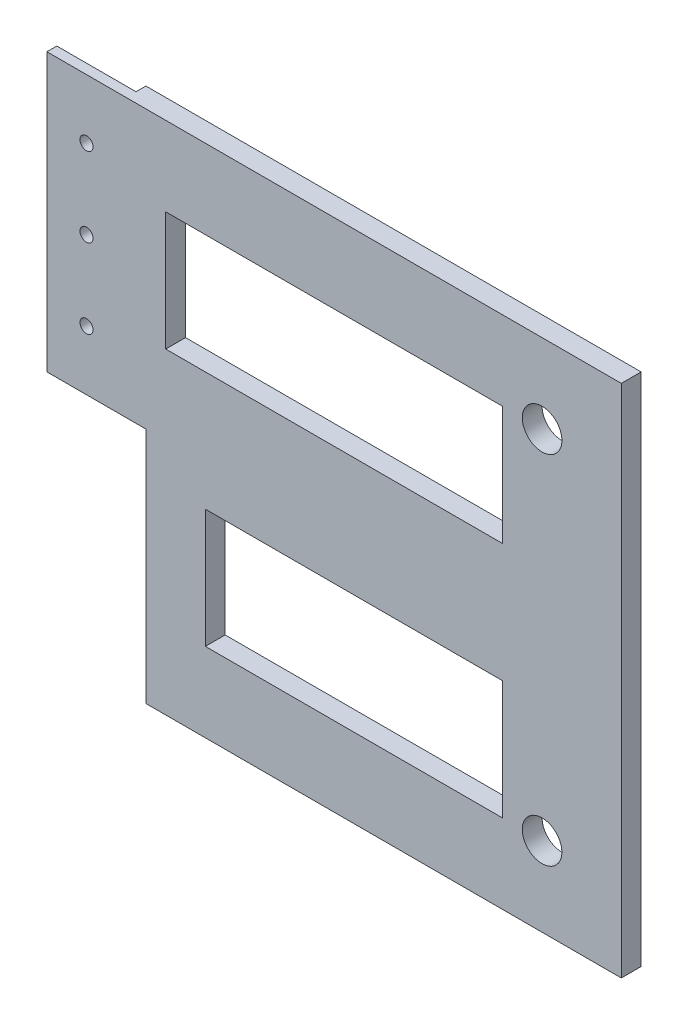
ISO-10303-21;
HEADER;
FILE_DESCRIPTION(('STEP AP214'),'2;1');
FILE_NAME('part.step','',(''),(''),'','','');
FILE_SCHEMA(('AUTOMOTIVE_DESIGN { 1 0 10303 214 1 1 1 1 }'));
ENDSEC;
DATA;
#1=APPLICATION_CONTEXT('core data for automotive mechanical design processes');
#2=APPLICATION_PROTOCOL_DEFINITION('international standard','automotive_design',2000,#1);
#3=PRODUCT_CONTEXT('',#1,'mechanical');
#4=PRODUCT('Part','Part','',(#3));
#5=PRODUCT_RELATED_PRODUCT_CATEGORY('part','',(#4));
#6=PRODUCT_DEFINITION_FORMATION('','',#4);
#7=PRODUCT_DEFINITION_CONTEXT('part definition',#1,'design');
#8=PRODUCT_DEFINITION('design','',#6,#7);
#9=PRODUCT_DEFINITION_SHAPE('','',#8);
#10=(LENGTH_UNIT() NAMED_UNIT(*) SI_UNIT(.MILLI.,.METRE.));
#11=(NAMED_UNIT(*) PLANE_ANGLE_UNIT() SI_UNIT($,.RADIAN.));
#12=(NAMED_UNIT(*) SI_UNIT($,.STERADIAN.) SOLID_ANGLE_UNIT());
#13=UNCERTAINTY_MEASURE_WITH_UNIT(LENGTH_MEASURE(1.E-05),#10,'distance_accuracy_value','');
#14=(GEOMETRIC_REPRESENTATION_CONTEXT(3) GLOBAL_UNCERTAINTY_ASSIGNED_CONTEXT((#13)) GLOBAL_UNIT_ASSIGNED_CONTEXT((#10,
#11,#12)) REPRESENTATION_CONTEXT('',''));
#15=CARTESIAN_POINT('',(0.,0.,0.));
#16=DIRECTION('',(0.,0.,1.));
#17=DIRECTION('',(1.,0.,0.));
#18=AXIS2_PLACEMENT_3D('',#15,#16,#17);
#19=CARTESIAN_POINT('',(0.,0.,6.35));
#20=DIRECTION('',(0.,0.,1.));
#21=DIRECTION('',(1.,0.,0.));
#22=AXIS2_PLACEMENT_3D('',#19,#20,#21);
#23=PLANE('',#22);
#24=CARTESIAN_POINT('',(12.6999999999999,38.1,6.35));
#25=DIRECTION('',(0.,0.,1.));
#26=DIRECTION('',(1.,0.,0.));
#27=AXIS2_PLACEMENT_3D('',#24,#25,#26);
#28=CIRCLE('',#27,2.09999999999999);
#29=CARTESIAN_POINT('',(14.7999999999999,38.1,6.35));
#30=VERTEX_POINT('',#29);
#31=EDGE_CURVE('E545',#30,#30,#28,.T.);
#32=ORIENTED_EDGE('',*,*,#31,.F.);
#33=EDGE_LOOP('',(#32));
#34=FACE_BOUND('',#33,.T.);
#35=CARTESIAN_POINT('',(12.6999999999999,63.5,6.35));
#36=DIRECTION('',(0.,0.,1.));
#37=DIRECTION('',(1.,0.,0.));
#38=AXIS2_PLACEMENT_3D('',#35,#36,#37);
#39=CIRCLE('',#38,2.09999999999999);
#40=CARTESIAN_POINT('',(14.7999999999999,63.5,6.35));
#41=VERTEX_POINT('',#40);
#42=EDGE_CURVE('E41',#41,#41,#39,.T.);
#43=ORIENTED_EDGE('',*,*,#42,.F.);
#44=EDGE_LOOP('',(#43));
#45=FACE_BOUND('',#44,.T.);
#46=CARTESIAN_POINT('',(12.6999999999999,12.7,6.35));
#47=DIRECTION('',(0.,0.,1.));
#48=DIRECTION('',(1.,0.,0.));
#49=AXIS2_PLACEMENT_3D('',#46,#47,#48);
#50=CIRCLE('',#49,2.09999999999999);
#51=CARTESIAN_POINT('',(14.7999999999999,12.7,6.35));
#52=VERTEX_POINT('',#51);
#53=EDGE_CURVE('E202',#52,#52,#50,.T.);
#54=ORIENTED_EDGE('',*,*,#53,.F.);
#55=EDGE_LOOP('',(#54));
#56=FACE_BOUND('',#55,.T.);
#57=CARTESIAN_POINT('',(158.75,57.15,6.35));
#58=DIRECTION('',(0.,0.,1.));
#59=DIRECTION('',(1.,0.,0.));
#60=AXIS2_PLACEMENT_3D('',#57,#58,#59);
#61=CIRCLE('',#60,6.35);
#62=CARTESIAN_POINT('',(165.1,57.15,6.35));
#63=VERTEX_POINT('',#62);
#64=EDGE_CURVE('E269',#63,#63,#61,.T.);
#65=ORIENTED_EDGE('',*,*,#64,.F.);
#66=EDGE_LOOP('',(#65));
#67=FACE_BOUND('',#66,.T.);
#68=CARTESIAN_POINT('',(158.75,-57.15,6.35));
#69=DIRECTION('',(0.,0.,1.));
#70=DIRECTION('',(1.,0.,0.));
#71=AXIS2_PLACEMENT_3D('',#68,#69,#70);
#72=CIRCLE('',#71,6.35);
#73=CARTESIAN_POINT('',(165.1,-57.15,6.35));
#74=VERTEX_POINT('',#73);
#75=EDGE_CURVE('E263',#74,#74,#72,.T.);
#76=ORIENTED_EDGE('',*,*,#75,.F.);
#77=EDGE_LOOP('',(#76));
#78=FACE_BOUND('',#77,.T.);
#79=DIRECTION('',(1.,0.,0.));
#80=VECTOR('',#79,1.);
#81=CARTESIAN_POINT('',(31.7499999999999,-82.55,6.35));
#82=LINE('',#81,#80);
#83=CARTESIAN_POINT('',(31.7499999999999,-82.55,6.35));
#84=VERTEX_POINT('',#83);
#85=CARTESIAN_POINT('',(184.15,-82.55,6.35));
#86=VERTEX_POINT('',#85);
#87=EDGE_CURVE('E275',#84,#86,#82,.T.);
#88=ORIENTED_EDGE('',*,*,#87,.T.);
#89=DIRECTION('',(0.,1.,0.));
#90=VECTOR('',#89,1.);
#91=CARTESIAN_POINT('',(184.15,-82.55,6.35));
#92=LINE('',#91,#90);
#93=CARTESIAN_POINT('',(184.15,82.55,6.35));
#94=VERTEX_POINT('',#93);
#95=EDGE_CURVE('E278',#86,#94,#92,.T.);
#96=ORIENTED_EDGE('',*,*,#95,.T.);
#97=DIRECTION('',(1.,0.,0.));
#98=VECTOR('',#97,1.);
#99=CARTESIAN_POINT('',(0.,82.55,6.35));
#100=LINE('',#99,#98);
#101=CARTESIAN_POINT('',(0.,82.55,6.35));
#102=VERTEX_POINT('',#101);
#103=EDGE_CURVE('E281',#102,#94,#100,.T.);
#104=ORIENTED_EDGE('',*,*,#103,.F.);
#105=DIRECTION('',(0.,1.,0.));
#106=VECTOR('',#105,1.);
#107=CARTESIAN_POINT('',(0.,-6.34999999999999,6.35));
#108=LINE('',#107,#106);
#109=CARTESIAN_POINT('',(0.,-6.34999999999999,6.35));
#110=VERTEX_POINT('',#109);
#111=EDGE_CURVE('E173',#110,#102,#108,.T.);
#112=ORIENTED_EDGE('',*,*,#111,.F.);
#113=DIRECTION('',(1.,0.,0.));
#114=VECTOR('',#113,1.);
#115=CARTESIAN_POINT('',(0.,-6.34999999999999,6.35));
#116=LINE('',#115,#114);
#117=CARTESIAN_POINT('',(31.7499999999999,-6.34999999999999,6.35));
#118=VERTEX_POINT('',#117);
#119=EDGE_CURVE('E284',#110,#118,#116,.T.);
#120=ORIENTED_EDGE('',*,*,#119,.T.);
#121=DIRECTION('',(0.,-1.,0.));
#122=VECTOR('',#121,1.);
#123=CARTESIAN_POINT('',(31.7499999999999,-6.34999999999999,6.35));
#124=LINE('',#123,#122);
#125=EDGE_CURVE('E286',#118,#84,#124,.T.);
#126=ORIENTED_EDGE('',*,*,#125,.T.);
#127=EDGE_LOOP('',(#88,#96,#104,#112,#120,#126));
#128=FACE_BOUND('',#127,.T.);
#129=DIRECTION('',(-1.,0.,0.));
#130=VECTOR('',#129,1.);
#131=CARTESIAN_POINT('',(146.05,-19.05,6.35));
#132=LINE('',#131,#130);
#133=CARTESIAN_POINT('',(146.05,-19.05,6.35));
#134=VERTEX_POINT('',#133);
#135=CARTESIAN_POINT('',(50.7999999999999,-19.05,6.35));
#136=VERTEX_POINT('',#135);
#137=EDGE_CURVE('E252',#134,#136,#132,.T.);
#138=ORIENTED_EDGE('',*,*,#137,.F.);
#139=DIRECTION('',(0.,-1.,0.));
#140=VECTOR('',#139,1.);
#141=CARTESIAN_POINT('',(146.05,-19.05,6.35));
#142=LINE('',#141,#140);
#143=CARTESIAN_POINT('',(146.05,-57.15,6.35));
#144=VERTEX_POINT('',#143);
#145=EDGE_CURVE('E226',#134,#144,#142,.T.);
#146=ORIENTED_EDGE('',*,*,#145,.T.);
#147=DIRECTION('',(-1.,0.,0.));
#148=VECTOR('',#147,1.);
#149=CARTESIAN_POINT('',(146.05,-57.15,6.35));
#150=LINE('',#149,#148);
#151=CARTESIAN_POINT('',(50.7999999999999,-57.15,6.35));
#152=VERTEX_POINT('',#151);
#153=EDGE_CURVE('E258',#144,#152,#150,.T.);
#154=ORIENTED_EDGE('',*,*,#153,.T.);
#155=DIRECTION('',(0.,-1.,0.));
#156=VECTOR('',#155,1.);
#157=CARTESIAN_POINT('',(50.7999999999999,-19.05,6.35));
#158=LINE('',#157,#156);
#159=EDGE_CURVE('E255',#136,#152,#158,.T.);
#160=ORIENTED_EDGE('',*,*,#159,.F.);
#161=EDGE_LOOP('',(#138,#146,#154,#160));
#162=FACE_BOUND('',#161,.T.);
#163=DIRECTION('',(-1.,0.,0.));
#164=VECTOR('',#163,1.);
#165=CARTESIAN_POINT('',(0.,57.15,6.35));
#166=LINE('',#165,#164);
#167=CARTESIAN_POINT('',(146.05,57.15,6.35));
#168=VERTEX_POINT('',#167);
#169=CARTESIAN_POINT('',(38.1,57.15,6.35));
#170=VERTEX_POINT('',#169);
#171=EDGE_CURVE('E225',#168,#170,#166,.T.);
#172=ORIENTED_EDGE('',*,*,#171,.F.);
#173=DIRECTION('',(0.,-1.,0.));
#174=VECTOR('',#173,1.);
#175=CARTESIAN_POINT('',(146.05,0.,6.35));
#176=LINE('',#175,#174);
#177=CARTESIAN_POINT('',(146.05,19.05,6.35));
#178=VERTEX_POINT('',#177);
#179=EDGE_CURVE('E62',#168,#178,#176,.T.);
#180=ORIENTED_EDGE('',*,*,#179,.T.);
#181=DIRECTION('',(-1.,0.,0.));
#182=VECTOR('',#181,1.);
#183=CARTESIAN_POINT('',(0.,19.05,6.35));
#184=LINE('',#183,#182);
#185=CARTESIAN_POINT('',(38.1,19.05,6.35));
#186=VERTEX_POINT('',#185);
#187=EDGE_CURVE('E232',#178,#186,#184,.T.);
#188=ORIENTED_EDGE('',*,*,#187,.T.);
#189=DIRECTION('',(0.,-1.,0.));
#190=VECTOR('',#189,1.);
#191=CARTESIAN_POINT('',(38.1,0.,6.35));
#192=LINE('',#191,#190);
#193=EDGE_CURVE('E229',#170,#186,#192,.T.);
#194=ORIENTED_EDGE('',*,*,#193,.F.);
#195=EDGE_LOOP('',(#172,#180,#188,#194));
#196=FACE_BOUND('',#195,.T.);
#197=ADVANCED_FACE('F37',(#34,#45,#56,#67,#78,#128,#162,#196),#23,.T.);
#198=CARTESIAN_POINT('',(0.,0.,0.));
#199=DIRECTION('',(0.,0.,1.));
#200=DIRECTION('',(1.,0.,0.));
#201=AXIS2_PLACEMENT_3D('',#198,#199,#200);
#202=PLANE('',#201);
#203=DIRECTION('',(0.,-1.,0.));
#204=VECTOR('',#203,1.);
#205=CARTESIAN_POINT('',(146.05,0.,0.));
#206=LINE('',#205,#204);
#207=CARTESIAN_POINT('',(146.05,-19.05,0.));
#208=VERTEX_POINT('',#207);
#209=CARTESIAN_POINT('',(146.05,-57.15,0.));
#210=VERTEX_POINT('',#209);
#211=EDGE_CURVE('E194',#208,#210,#206,.T.);
#212=ORIENTED_EDGE('',*,*,#211,.F.);
#213=DIRECTION('',(-1.,0.,0.));
#214=VECTOR('',#213,1.);
#215=CARTESIAN_POINT('',(0.,-19.05,0.));
#216=LINE('',#215,#214);
#217=CARTESIAN_POINT('',(50.7999999999999,-19.05,0.));
#218=VERTEX_POINT('',#217);
#219=EDGE_CURVE('E186',#208,#218,#216,.T.);
#220=ORIENTED_EDGE('',*,*,#219,.T.);
#221=DIRECTION('',(0.,-1.,0.));
#222=VECTOR('',#221,1.);
#223=CARTESIAN_POINT('',(50.7999999999999,0.,0.));
#224=LINE('',#223,#222);
#225=CARTESIAN_POINT('',(50.7999999999999,-57.15,0.));
#226=VERTEX_POINT('',#225);
#227=EDGE_CURVE('E189',#218,#226,#224,.T.);
#228=ORIENTED_EDGE('',*,*,#227,.T.);
#229=DIRECTION('',(-1.,0.,0.));
#230=VECTOR('',#229,1.);
#231=CARTESIAN_POINT('',(0.,-57.15,0.));
#232=LINE('',#231,#230);
#233=EDGE_CURVE('E192',#210,#226,#232,.T.);
#234=ORIENTED_EDGE('',*,*,#233,.F.);
#235=EDGE_LOOP('',(#212,#220,#228,#234));
#236=FACE_BOUND('',#235,.T.);
#237=CARTESIAN_POINT('',(158.75,57.15,0.));
#238=DIRECTION('',(0.,0.,1.));
#239=DIRECTION('',(1.,0.,0.));
#240=AXIS2_PLACEMENT_3D('',#237,#238,#239);
#241=CIRCLE('',#240,6.35);
#242=CARTESIAN_POINT('',(165.1,57.15,0.));
#243=VERTEX_POINT('',#242);
#244=EDGE_CURVE('E266',#243,#243,#241,.T.);
#245=ORIENTED_EDGE('',*,*,#244,.T.);
#246=EDGE_LOOP('',(#245));
#247=FACE_BOUND('',#246,.T.);
#248=CARTESIAN_POINT('',(158.75,-57.15,0.));
#249=DIRECTION('',(0.,0.,1.));
#250=DIRECTION('',(1.,0.,0.));
#251=AXIS2_PLACEMENT_3D('',#248,#249,#250);
#252=CIRCLE('',#251,6.35);
#253=CARTESIAN_POINT('',(165.1,-57.15,0.));
#254=VERTEX_POINT('',#253);
#255=EDGE_CURVE('E238',#254,#254,#252,.T.);
#256=ORIENTED_EDGE('',*,*,#255,.T.);
#257=EDGE_LOOP('',(#256));
#258=FACE_BOUND('',#257,.T.);
#259=DIRECTION('',(1.,0.,0.));
#260=VECTOR('',#259,1.);
#261=CARTESIAN_POINT('',(0.,-6.34999999999999,0.));
#262=LINE('',#261,#260);
#263=CARTESIAN_POINT('',(25.3999999999999,-6.34999999999999,0.));
#264=VERTEX_POINT('',#263);
#265=CARTESIAN_POINT('',(31.7499999999999,-6.34999999999999,0.));
#266=VERTEX_POINT('',#265);
#267=EDGE_CURVE('E296',#264,#266,#262,.T.);
#268=ORIENTED_EDGE('',*,*,#267,.F.);
#269=DIRECTION('',(0.,-1.,0.));
#270=VECTOR('',#269,1.);
#271=CARTESIAN_POINT('',(25.3999999999999,82.55,0.));
#272=LINE('',#271,#270);
#273=CARTESIAN_POINT('',(25.3999999999999,82.55,0.));
#274=VERTEX_POINT('',#273);
#275=EDGE_CURVE('E160',#274,#264,#272,.T.);
#276=ORIENTED_EDGE('',*,*,#275,.F.);
#277=DIRECTION('',(1.,0.,0.));
#278=VECTOR('',#277,1.);
#279=CARTESIAN_POINT('',(0.,82.55,0.));
#280=LINE('',#279,#278);
#281=CARTESIAN_POINT('',(184.15,82.55,0.));
#282=VERTEX_POINT('',#281);
#283=EDGE_CURVE('E294',#274,#282,#280,.T.);
#284=ORIENTED_EDGE('',*,*,#283,.T.);
#285=DIRECTION('',(0.,1.,0.));
#286=VECTOR('',#285,1.);
#287=CARTESIAN_POINT('',(184.15,-82.55,0.));
#288=LINE('',#287,#286);
#289=CARTESIAN_POINT('',(184.15,-82.55,0.));
#290=VERTEX_POINT('',#289);
#291=EDGE_CURVE('E291',#290,#282,#288,.T.);
#292=ORIENTED_EDGE('',*,*,#291,.F.);
#293=DIRECTION('',(1.,0.,0.));
#294=VECTOR('',#293,1.);
#295=CARTESIAN_POINT('',(31.7499999999999,-82.55,0.));
#296=LINE('',#295,#294);
#297=CARTESIAN_POINT('',(31.7499999999999,-82.55,0.));
#298=VERTEX_POINT('',#297);
#299=EDGE_CURVE('E272',#298,#290,#296,.T.);
#300=ORIENTED_EDGE('',*,*,#299,.F.);
#301=DIRECTION('',(0.,-1.,0.));
#302=VECTOR('',#301,1.);
#303=CARTESIAN_POINT('',(31.7499999999999,-6.34999999999999,0.));
#304=LINE('',#303,#302);
#305=EDGE_CURVE('E279',#266,#298,#304,.T.);
#306=ORIENTED_EDGE('',*,*,#305,.F.);
#307=EDGE_LOOP('',(#268,#276,#284,#292,#300,#306));
#308=FACE_BOUND('',#307,.T.);
#309=DIRECTION('',(0.,-1.,0.));
#310=VECTOR('',#309,1.);
#311=CARTESIAN_POINT('',(146.05,0.,0.));
#312=LINE('',#311,#310);
#313=CARTESIAN_POINT('',(146.05,57.15,0.));
#314=VERTEX_POINT('',#313);
#315=CARTESIAN_POINT('',(146.05,19.05,0.));
#316=VERTEX_POINT('',#315);
#317=EDGE_CURVE('E11',#314,#316,#312,.T.);
#318=ORIENTED_EDGE('',*,*,#317,.F.);
#319=DIRECTION('',(-1.,0.,0.));
#320=VECTOR('',#319,1.);
#321=CARTESIAN_POINT('',(0.,57.15,0.));
#322=LINE('',#321,#320);
#323=CARTESIAN_POINT('',(38.1,57.15,0.));
#324=VERTEX_POINT('',#323);
#325=EDGE_CURVE('E196',#314,#324,#322,.T.);
#326=ORIENTED_EDGE('',*,*,#325,.T.);
#327=DIRECTION('',(0.,-1.,0.));
#328=VECTOR('',#327,1.);
#329=CARTESIAN_POINT('',(38.1,0.,0.));
#330=LINE('',#329,#328);
#331=CARTESIAN_POINT('',(38.1,19.05,0.));
#332=VERTEX_POINT('',#331);
#333=EDGE_CURVE('E199',#324,#332,#330,.T.);
#334=ORIENTED_EDGE('',*,*,#333,.T.);
#335=DIRECTION('',(-1.,0.,0.));
#336=VECTOR('',#335,1.);
#337=CARTESIAN_POINT('',(0.,19.05,0.));
#338=LINE('',#337,#336);
#339=EDGE_CURVE('E46',#316,#332,#338,.T.);
#340=ORIENTED_EDGE('',*,*,#339,.F.);
#341=EDGE_LOOP('',(#318,#326,#334,#340));
#342=FACE_BOUND('',#341,.T.);
#343=ADVANCED_FACE('F312',(#236,#247,#258,#308,#342),#202,.F.);
#344=CARTESIAN_POINT('',(31.7499999999999,-82.55,6.35));
#345=DIRECTION('',(0.,1.,0.));
#346=DIRECTION('',(0.,0.,1.));
#347=AXIS2_PLACEMENT_3D('',#344,#345,#346);
#348=PLANE('',#347);
#349=ORIENTED_EDGE('',*,*,#299,.T.);
#350=DIRECTION('',(0.,0.,-1.));
#351=VECTOR('',#350,1.);
#352=CARTESIAN_POINT('',(184.15,-82.55,6.35));
#353=LINE('',#352,#351);
#354=EDGE_CURVE('E178',#86,#290,#353,.T.);
#355=ORIENTED_EDGE('',*,*,#354,.F.);
#356=ORIENTED_EDGE('',*,*,#87,.F.);
#357=DIRECTION('',(0.,0.,-1.));
#358=VECTOR('',#357,1.);
#359=CARTESIAN_POINT('',(31.7499999999999,-82.55,6.35));
#360=LINE('',#359,#358);
#361=EDGE_CURVE('E288',#84,#298,#360,.T.);
#362=ORIENTED_EDGE('',*,*,#361,.T.);
#363=EDGE_LOOP('',(#349,#355,#356,#362));
#364=FACE_BOUND('',#363,.T.);
#365=ADVANCED_FACE('F39',(#364),#348,.F.);
#366=CARTESIAN_POINT('',(184.15,-82.55,6.35));
#367=DIRECTION('',(-1.,0.,0.));
#368=DIRECTION('',(0.,0.,1.));
#369=AXIS2_PLACEMENT_3D('',#366,#367,#368);
#370=PLANE('',#369);
#371=ORIENTED_EDGE('',*,*,#291,.T.);
#372=DIRECTION('',(0.,0.,-1.));
#373=VECTOR('',#372,1.);
#374=CARTESIAN_POINT('',(184.15,82.55,6.35));
#375=LINE('',#374,#373);
#376=EDGE_CURVE('E174',#94,#282,#375,.T.);
#377=ORIENTED_EDGE('',*,*,#376,.F.);
#378=ORIENTED_EDGE('',*,*,#95,.F.);
#379=ORIENTED_EDGE('',*,*,#354,.T.);
#380=EDGE_LOOP('',(#371,#377,#378,#379));
#381=FACE_BOUND('',#380,.T.);
#382=ADVANCED_FACE('F325',(#381),#370,.F.);
#383=CARTESIAN_POINT('',(0.,82.55,6.35));
#384=DIRECTION('',(0.,1.,0.));
#385=DIRECTION('',(0.,0.,1.));
#386=AXIS2_PLACEMENT_3D('',#383,#384,#385);
#387=PLANE('',#386);
#388=DIRECTION('',(0.,0.,-1.));
#389=VECTOR('',#388,1.);
#390=CARTESIAN_POINT('',(25.3999999999999,82.55,3.175));
#391=LINE('',#390,#389);
#392=CARTESIAN_POINT('',(25.3999999999999,82.55,3.175));
#393=VERTEX_POINT('',#392);
#394=EDGE_CURVE('E168',#393,#274,#391,.T.);
#395=ORIENTED_EDGE('',*,*,#394,.F.);
#396=DIRECTION('',(1.,0.,0.));
#397=VECTOR('',#396,1.);
#398=CARTESIAN_POINT('',(0.,82.55,3.175));
#399=LINE('',#398,#397);
#400=CARTESIAN_POINT('',(0.,82.55,3.175));
#401=VERTEX_POINT('',#400);
#402=EDGE_CURVE('E153',#401,#393,#399,.T.);
#403=ORIENTED_EDGE('',*,*,#402,.F.);
#404=DIRECTION('',(0.,0.,-1.));
#405=VECTOR('',#404,1.);
#406=CARTESIAN_POINT('',(0.,82.55,6.35));
#407=LINE('',#406,#405);
#408=EDGE_CURVE('E165',#102,#401,#407,.T.);
#409=ORIENTED_EDGE('',*,*,#408,.F.);
#410=ORIENTED_EDGE('',*,*,#103,.T.);
#411=ORIENTED_EDGE('',*,*,#376,.T.);
#412=ORIENTED_EDGE('',*,*,#283,.F.);
#413=EDGE_LOOP('',(#395,#403,#409,#410,#411,#412));
#414=FACE_BOUND('',#413,.T.);
#415=ADVANCED_FACE('F163',(#414),#387,.T.);
#416=CARTESIAN_POINT('',(0.,-6.34999999999999,6.35));
#417=DIRECTION('',(-1.,0.,0.));
#418=DIRECTION('',(0.,-1.,0.));
#419=AXIS2_PLACEMENT_3D('',#416,#417,#418);
#420=PLANE('',#419);
#421=DIRECTION('',(0.,1.,0.));
#422=VECTOR('',#421,1.);
#423=CARTESIAN_POINT('',(0.,82.55,3.175));
#424=LINE('',#423,#422);
#425=CARTESIAN_POINT('',(0.,-6.34999999999999,3.175));
#426=VERTEX_POINT('',#425);
#427=EDGE_CURVE('E150',#426,#401,#424,.T.);
#428=ORIENTED_EDGE('',*,*,#427,.F.);
#429=DIRECTION('',(0.,0.,-1.));
#430=VECTOR('',#429,1.);
#431=CARTESIAN_POINT('',(0.,-6.34999999999999,6.35));
#432=LINE('',#431,#430);
#433=EDGE_CURVE('E175',#110,#426,#432,.T.);
#434=ORIENTED_EDGE('',*,*,#433,.F.);
#435=ORIENTED_EDGE('',*,*,#111,.T.);
#436=ORIENTED_EDGE('',*,*,#408,.T.);
#437=EDGE_LOOP('',(#428,#434,#435,#436));
#438=FACE_BOUND('',#437,.T.);
#439=ADVANCED_FACE('F171',(#438),#420,.T.);
#440=CARTESIAN_POINT('',(0.,-6.34999999999999,6.35));
#441=DIRECTION('',(0.,1.,0.));
#442=DIRECTION('',(0.,0.,1.));
#443=AXIS2_PLACEMENT_3D('',#440,#441,#442);
#444=PLANE('',#443);
#445=DIRECTION('',(-1.,0.,0.));
#446=VECTOR('',#445,1.);
#447=CARTESIAN_POINT('',(0.,-6.34999999999999,3.175));
#448=LINE('',#447,#446);
#449=CARTESIAN_POINT('',(25.3999999999999,-6.34999999999999,3.175));
#450=VERTEX_POINT('',#449);
#451=EDGE_CURVE('E156',#450,#426,#448,.T.);
#452=ORIENTED_EDGE('',*,*,#451,.F.);
#453=DIRECTION('',(0.,0.,-1.));
#454=VECTOR('',#453,1.);
#455=CARTESIAN_POINT('',(25.3999999999999,-6.34999999999999,3.175));
#456=LINE('',#455,#454);
#457=EDGE_CURVE('E219',#450,#264,#456,.T.);
#458=ORIENTED_EDGE('',*,*,#457,.T.);
#459=ORIENTED_EDGE('',*,*,#267,.T.);
#460=DIRECTION('',(0.,0.,-1.));
#461=VECTOR('',#460,1.);
#462=CARTESIAN_POINT('',(31.7499999999999,-6.34999999999999,6.35));
#463=LINE('',#462,#461);
#464=EDGE_CURVE('E180',#118,#266,#463,.T.);
#465=ORIENTED_EDGE('',*,*,#464,.F.);
#466=ORIENTED_EDGE('',*,*,#119,.F.);
#467=ORIENTED_EDGE('',*,*,#433,.T.);
#468=EDGE_LOOP('',(#452,#458,#459,#465,#466,#467));
#469=FACE_BOUND('',#468,.T.);
#470=ADVANCED_FACE('F321',(#469),#444,.F.);
#471=CARTESIAN_POINT('',(31.7499999999999,-6.34999999999999,6.35));
#472=DIRECTION('',(1.,0.,0.));
#473=DIRECTION('',(0.,1.,0.));
#474=AXIS2_PLACEMENT_3D('',#471,#472,#473);
#475=PLANE('',#474);
#476=ORIENTED_EDGE('',*,*,#305,.T.);
#477=ORIENTED_EDGE('',*,*,#361,.F.);
#478=ORIENTED_EDGE('',*,*,#125,.F.);
#479=ORIENTED_EDGE('',*,*,#464,.T.);
#480=EDGE_LOOP('',(#476,#477,#478,#479));
#481=FACE_BOUND('',#480,.T.);
#482=ADVANCED_FACE('F305',(#481),#475,.F.);
#483=CARTESIAN_POINT('',(158.75,-57.15,0.));
#484=DIRECTION('',(0.,0.,1.));
#485=DIRECTION('',(1.,0.,0.));
#486=AXIS2_PLACEMENT_3D('',#483,#484,#485);
#487=CYLINDRICAL_SURFACE('',#486,6.35);
#488=ORIENTED_EDGE('',*,*,#255,.F.);
#489=EDGE_LOOP('',(#488));
#490=FACE_BOUND('',#489,.T.);
#491=ORIENTED_EDGE('',*,*,#75,.T.);
#492=EDGE_LOOP('',(#491));
#493=FACE_BOUND('',#492,.T.);
#494=ADVANCED_FACE('F348',(#490,#493),#487,.F.);
#495=CARTESIAN_POINT('',(158.75,57.15,0.));
#496=DIRECTION('',(0.,0.,1.));
#497=DIRECTION('',(1.,0.,0.));
#498=AXIS2_PLACEMENT_3D('',#495,#496,#497);
#499=CYLINDRICAL_SURFACE('',#498,6.35);
#500=ORIENTED_EDGE('',*,*,#244,.F.);
#501=EDGE_LOOP('',(#500));
#502=FACE_BOUND('',#501,.T.);
#503=ORIENTED_EDGE('',*,*,#64,.T.);
#504=EDGE_LOOP('',(#503));
#505=FACE_BOUND('',#504,.T.);
#506=ADVANCED_FACE('F343',(#502,#505),#499,.F.);
#507=CARTESIAN_POINT('',(146.05,-19.05,-3.81));
#508=DIRECTION('',(-1.,0.,0.));
#509=DIRECTION('',(0.,0.,1.));
#510=AXIS2_PLACEMENT_3D('',#507,#508,#509);
#511=PLANE('',#510);
#512=ORIENTED_EDGE('',*,*,#211,.T.);
#513=DIRECTION('',(0.,0.,1.));
#514=VECTOR('',#513,1.);
#515=CARTESIAN_POINT('',(146.05,-57.15,-3.81));
#516=LINE('',#515,#514);
#517=EDGE_CURVE('E222',#210,#144,#516,.T.);
#518=ORIENTED_EDGE('',*,*,#517,.T.);
#519=ORIENTED_EDGE('',*,*,#145,.F.);
#520=DIRECTION('',(0.,0.,1.));
#521=VECTOR('',#520,1.);
#522=CARTESIAN_POINT('',(146.05,-19.05,-3.81));
#523=LINE('',#522,#521);
#524=EDGE_CURVE('E249',#208,#134,#523,.T.);
#525=ORIENTED_EDGE('',*,*,#524,.F.);
#526=EDGE_LOOP('',(#512,#518,#519,#525));
#527=FACE_BOUND('',#526,.T.);
#528=ADVANCED_FACE('F377',(#527),#511,.T.);
#529=CARTESIAN_POINT('',(146.05,-57.15,-3.81));
#530=DIRECTION('',(0.,1.,0.));
#531=DIRECTION('',(-1.,0.,0.));
#532=AXIS2_PLACEMENT_3D('',#529,#530,#531);
#533=PLANE('',#532);
#534=ORIENTED_EDGE('',*,*,#233,.T.);
#535=DIRECTION('',(0.,0.,1.));
#536=VECTOR('',#535,1.);
#537=CARTESIAN_POINT('',(50.7999999999999,-57.15,-3.81));
#538=LINE('',#537,#536);
#539=EDGE_CURVE('E245',#226,#152,#538,.T.);
#540=ORIENTED_EDGE('',*,*,#539,.T.);
#541=ORIENTED_EDGE('',*,*,#153,.F.);
#542=ORIENTED_EDGE('',*,*,#517,.F.);
#543=EDGE_LOOP('',(#534,#540,#541,#542));
#544=FACE_BOUND('',#543,.T.);
#545=ADVANCED_FACE('F384',(#544),#533,.T.);
#546=CARTESIAN_POINT('',(50.7999999999999,-19.05,-3.81));
#547=DIRECTION('',(-1.,0.,0.));
#548=DIRECTION('',(0.,0.,1.));
#549=AXIS2_PLACEMENT_3D('',#546,#547,#548);
#550=PLANE('',#549);
#551=DIRECTION('',(0.,0.,1.));
#552=VECTOR('',#551,1.);
#553=CARTESIAN_POINT('',(50.7999999999999,-19.05,-3.81));
#554=LINE('',#553,#552);
#555=EDGE_CURVE('E247',#218,#136,#554,.T.);
#556=ORIENTED_EDGE('',*,*,#555,.T.);
#557=ORIENTED_EDGE('',*,*,#159,.T.);
#558=ORIENTED_EDGE('',*,*,#539,.F.);
#559=ORIENTED_EDGE('',*,*,#227,.F.);
#560=EDGE_LOOP('',(#556,#557,#558,#559));
#561=FACE_BOUND('',#560,.T.);
#562=ADVANCED_FACE('F392',(#561),#550,.F.);
#563=CARTESIAN_POINT('',(146.05,-19.05,-3.81));
#564=DIRECTION('',(0.,1.,0.));
#565=DIRECTION('',(0.,0.,1.));
#566=AXIS2_PLACEMENT_3D('',#563,#564,#565);
#567=PLANE('',#566);
#568=ORIENTED_EDGE('',*,*,#524,.T.);
#569=ORIENTED_EDGE('',*,*,#137,.T.);
#570=ORIENTED_EDGE('',*,*,#555,.F.);
#571=ORIENTED_EDGE('',*,*,#219,.F.);
#572=EDGE_LOOP('',(#568,#569,#570,#571));
#573=FACE_BOUND('',#572,.T.);
#574=ADVANCED_FACE('F400',(#573),#567,.F.);
#575=CARTESIAN_POINT('',(146.05,0.,-3.81));
#576=DIRECTION('',(-1.,0.,0.));
#577=DIRECTION('',(0.,0.,1.));
#578=AXIS2_PLACEMENT_3D('',#575,#576,#577);
#579=PLANE('',#578);
#580=ORIENTED_EDGE('',*,*,#317,.T.);
#581=DIRECTION('',(0.,0.,1.));
#582=VECTOR('',#581,1.);
#583=CARTESIAN_POINT('',(146.05,19.05,-3.81));
#584=LINE('',#583,#582);
#585=EDGE_CURVE('E236',#316,#178,#584,.T.);
#586=ORIENTED_EDGE('',*,*,#585,.T.);
#587=ORIENTED_EDGE('',*,*,#179,.F.);
#588=DIRECTION('',(0.,0.,1.));
#589=VECTOR('',#588,1.);
#590=CARTESIAN_POINT('',(146.05,57.15,-3.81));
#591=LINE('',#590,#589);
#592=EDGE_CURVE('E235',#314,#168,#591,.T.);
#593=ORIENTED_EDGE('',*,*,#592,.F.);
#594=EDGE_LOOP('',(#580,#586,#587,#593));
#595=FACE_BOUND('',#594,.T.);
#596=ADVANCED_FACE('F408',(#595),#579,.T.);
#597=CARTESIAN_POINT('',(0.,19.05,-3.81));
#598=DIRECTION('',(0.,1.,0.));
#599=DIRECTION('',(-1.,0.,0.));
#600=AXIS2_PLACEMENT_3D('',#597,#598,#599);
#601=PLANE('',#600);
#602=ORIENTED_EDGE('',*,*,#339,.T.);
#603=DIRECTION('',(0.,0.,1.));
#604=VECTOR('',#603,1.);
#605=CARTESIAN_POINT('',(38.1,19.05,-3.81));
#606=LINE('',#605,#604);
#607=EDGE_CURVE('E239',#332,#186,#606,.T.);
#608=ORIENTED_EDGE('',*,*,#607,.T.);
#609=ORIENTED_EDGE('',*,*,#187,.F.);
#610=ORIENTED_EDGE('',*,*,#585,.F.);
#611=EDGE_LOOP('',(#602,#608,#609,#610));
#612=FACE_BOUND('',#611,.T.);
#613=ADVANCED_FACE('F416',(#612),#601,.T.);
#614=CARTESIAN_POINT('',(38.1,0.,-3.81));
#615=DIRECTION('',(-1.,0.,0.));
#616=DIRECTION('',(0.,-1.,0.));
#617=AXIS2_PLACEMENT_3D('',#614,#615,#616);
#618=PLANE('',#617);
#619=DIRECTION('',(0.,0.,1.));
#620=VECTOR('',#619,1.);
#621=CARTESIAN_POINT('',(38.1,57.15,-3.81));
#622=LINE('',#621,#620);
#623=EDGE_CURVE('E241',#324,#170,#622,.T.);
#624=ORIENTED_EDGE('',*,*,#623,.T.);
#625=ORIENTED_EDGE('',*,*,#193,.T.);
#626=ORIENTED_EDGE('',*,*,#607,.F.);
#627=ORIENTED_EDGE('',*,*,#333,.F.);
#628=EDGE_LOOP('',(#624,#625,#626,#627));
#629=FACE_BOUND('',#628,.T.);
#630=ADVANCED_FACE('F423',(#629),#618,.F.);
#631=CARTESIAN_POINT('',(0.,57.15,-3.81));
#632=DIRECTION('',(0.,1.,0.));
#633=DIRECTION('',(-1.,0.,0.));
#634=AXIS2_PLACEMENT_3D('',#631,#632,#633);
#635=PLANE('',#634);
#636=ORIENTED_EDGE('',*,*,#592,.T.);
#637=ORIENTED_EDGE('',*,*,#171,.T.);
#638=ORIENTED_EDGE('',*,*,#623,.F.);
#639=ORIENTED_EDGE('',*,*,#325,.F.);
#640=EDGE_LOOP('',(#636,#637,#638,#639));
#641=FACE_BOUND('',#640,.T.);
#642=ADVANCED_FACE('F431',(#641),#635,.F.);
#643=CARTESIAN_POINT('',(25.3999999999999,82.55,3.175));
#644=DIRECTION('',(1.,0.,0.));
#645=DIRECTION('',(0.,1.,0.));
#646=AXIS2_PLACEMENT_3D('',#643,#644,#645);
#647=PLANE('',#646);
#648=ORIENTED_EDGE('',*,*,#275,.T.);
#649=ORIENTED_EDGE('',*,*,#457,.F.);
#650=DIRECTION('',(0.,-1.,0.));
#651=VECTOR('',#650,1.);
#652=CARTESIAN_POINT('',(25.3999999999999,82.55,3.175));
#653=LINE('',#652,#651);
#654=EDGE_CURVE('E54',#393,#450,#653,.T.);
#655=ORIENTED_EDGE('',*,*,#654,.F.);
#656=ORIENTED_EDGE('',*,*,#394,.T.);
#657=EDGE_LOOP('',(#648,#649,#655,#656));
#658=FACE_BOUND('',#657,.T.);
#659=ADVANCED_FACE('F323',(#658),#647,.F.);
#660=CARTESIAN_POINT('',(0.,0.,3.175));
#661=DIRECTION('',(0.,0.,1.));
#662=DIRECTION('',(1.,0.,0.));
#663=AXIS2_PLACEMENT_3D('',#660,#661,#662);
#664=PLANE('',#663);
#665=CARTESIAN_POINT('',(12.6999999999999,38.1,3.175));
#666=DIRECTION('',(0.,0.,-1.));
#667=DIRECTION('',(-1.,0.,0.));
#668=AXIS2_PLACEMENT_3D('',#665,#666,#667);
#669=CIRCLE('',#668,2.09999999999999);
#670=CARTESIAN_POINT('',(10.6,38.1,3.175));
#671=VERTEX_POINT('',#670);
#672=EDGE_CURVE('E548',#671,#671,#669,.T.);
#673=ORIENTED_EDGE('',*,*,#672,.F.);
#674=EDGE_LOOP('',(#673));
#675=FACE_BOUND('',#674,.T.);
#676=CARTESIAN_POINT('',(12.6999999999999,63.5,3.175));
#677=DIRECTION('',(0.,0.,-1.));
#678=DIRECTION('',(-1.,0.,0.));
#679=AXIS2_PLACEMENT_3D('',#676,#677,#678);
#680=CIRCLE('',#679,2.09999999999999);
#681=CARTESIAN_POINT('',(10.6,63.5,3.175));
#682=VERTEX_POINT('',#681);
#683=EDGE_CURVE('E213',#682,#682,#680,.T.);
#684=ORIENTED_EDGE('',*,*,#683,.F.);
#685=EDGE_LOOP('',(#684));
#686=FACE_BOUND('',#685,.T.);
#687=CARTESIAN_POINT('',(12.6999999999999,12.7,3.175));
#688=DIRECTION('',(0.,0.,-1.));
#689=DIRECTION('',(-1.,0.,0.));
#690=AXIS2_PLACEMENT_3D('',#687,#688,#689);
#691=CIRCLE('',#690,2.09999999999999);
#692=CARTESIAN_POINT('',(10.6,12.7,3.175));
#693=VERTEX_POINT('',#692);
#694=EDGE_CURVE('E204',#693,#693,#691,.T.);
#695=ORIENTED_EDGE('',*,*,#694,.F.);
#696=EDGE_LOOP('',(#695));
#697=FACE_BOUND('',#696,.T.);
#698=ORIENTED_EDGE('',*,*,#427,.T.);
#699=ORIENTED_EDGE('',*,*,#402,.T.);
#700=ORIENTED_EDGE('',*,*,#654,.T.);
#701=ORIENTED_EDGE('',*,*,#451,.T.);
#702=EDGE_LOOP('',(#698,#699,#700,#701));
#703=FACE_BOUND('',#702,.T.);
#704=ADVANCED_FACE('F152',(#675,#686,#697,#703),#664,.F.);
#705=CARTESIAN_POINT('',(12.6999999999999,12.7,3.175));
#706=DIRECTION('',(0.,0.,-1.));
#707=DIRECTION('',(-1.,0.,0.));
#708=AXIS2_PLACEMENT_3D('',#705,#706,#707);
#709=CYLINDRICAL_SURFACE('',#708,2.09999999999999);
#710=ORIENTED_EDGE('',*,*,#53,.T.);
#711=EDGE_LOOP('',(#710));
#712=FACE_BOUND('',#711,.T.);
#713=ORIENTED_EDGE('',*,*,#694,.T.);
#714=EDGE_LOOP('',(#713));
#715=FACE_BOUND('',#714,.T.);
#716=ADVANCED_FACE('F452',(#712,#715),#709,.F.);
#717=CARTESIAN_POINT('',(12.6999999999999,63.5,3.175));
#718=DIRECTION('',(0.,0.,-1.));
#719=DIRECTION('',(-1.,0.,0.));
#720=AXIS2_PLACEMENT_3D('',#717,#718,#719);
#721=CYLINDRICAL_SURFACE('',#720,2.09999999999999);
#722=ORIENTED_EDGE('',*,*,#42,.T.);
#723=EDGE_LOOP('',(#722));
#724=FACE_BOUND('',#723,.T.);
#725=ORIENTED_EDGE('',*,*,#683,.T.);
#726=EDGE_LOOP('',(#725));
#727=FACE_BOUND('',#726,.T.);
#728=ADVANCED_FACE('F461',(#724,#727),#721,.F.);
#729=CARTESIAN_POINT('',(12.6999999999999,38.1,3.175));
#730=DIRECTION('',(0.,0.,-1.));
#731=DIRECTION('',(-1.,0.,0.));
#732=AXIS2_PLACEMENT_3D('',#729,#730,#731);
#733=CYLINDRICAL_SURFACE('',#732,2.09999999999999);
#734=ORIENTED_EDGE('',*,*,#31,.T.);
#735=EDGE_LOOP('',(#734));
#736=FACE_BOUND('',#735,.T.);
#737=ORIENTED_EDGE('',*,*,#672,.T.);
#738=EDGE_LOOP('',(#737));
#739=FACE_BOUND('',#738,.T.);
#740=ADVANCED_FACE('F468',(#736,#739),#733,.F.);
#741=CLOSED_SHELL('',(#197,#343,#365,#382,#415,#439,#470,#482,#494,#506,#528,#545,#562,#574,
#596,#613,#630,#642,#659,#704,#716,#728,#740));
#742=MANIFOLD_SOLID_BREP('B2',#741);
#743=ADVANCED_BREP_SHAPE_REPRESENTATION('',(#18,#742),#14);
#744=SHAPE_DEFINITION_REPRESENTATION(#9,#743);
ENDSEC;
END-ISO-10303-21;
